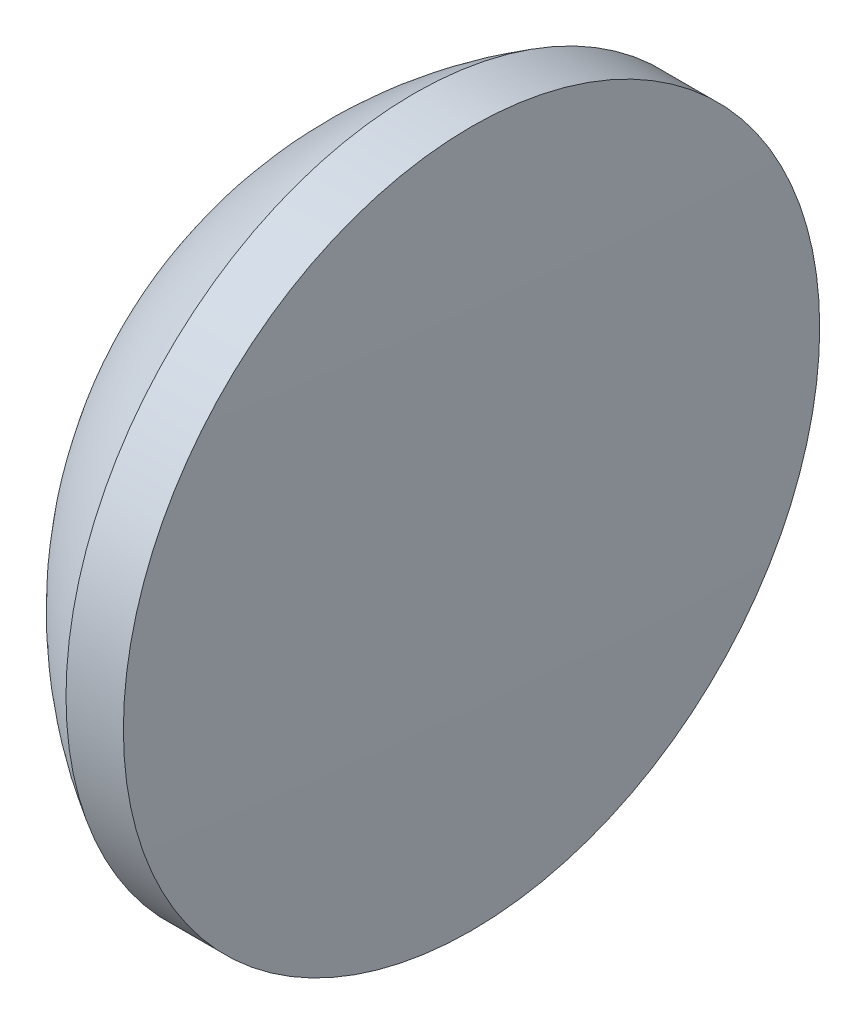
ISO-10303-21;
HEADER;
FILE_DESCRIPTION(('STEP AP214'),'2;1');
FILE_NAME('part.step','',(''),(''),'','','');
FILE_SCHEMA(('AUTOMOTIVE_DESIGN { 1 0 10303 214 1 1 1 1 }'));
ENDSEC;
DATA;
#1=APPLICATION_CONTEXT('core data for automotive mechanical design processes');
#2=APPLICATION_PROTOCOL_DEFINITION('international standard','automotive_design',2000,#1);
#3=PRODUCT_CONTEXT('',#1,'mechanical');
#4=PRODUCT('Part','Part','',(#3));
#5=PRODUCT_RELATED_PRODUCT_CATEGORY('part','',(#4));
#6=PRODUCT_DEFINITION_FORMATION('','',#4);
#7=PRODUCT_DEFINITION_CONTEXT('part definition',#1,'design');
#8=PRODUCT_DEFINITION('design','',#6,#7);
#9=PRODUCT_DEFINITION_SHAPE('','',#8);
#10=(LENGTH_UNIT() NAMED_UNIT(*) SI_UNIT(.MILLI.,.METRE.));
#11=(NAMED_UNIT(*) PLANE_ANGLE_UNIT() SI_UNIT($,.RADIAN.));
#12=(NAMED_UNIT(*) SI_UNIT($,.STERADIAN.) SOLID_ANGLE_UNIT());
#13=UNCERTAINTY_MEASURE_WITH_UNIT(LENGTH_MEASURE(1.E-05),#10,'distance_accuracy_value','');
#14=(GEOMETRIC_REPRESENTATION_CONTEXT(3) GLOBAL_UNCERTAINTY_ASSIGNED_CONTEXT((#13)) GLOBAL_UNIT_ASSIGNED_CONTEXT((#10,
#11,#12)) REPRESENTATION_CONTEXT('',''));
#15=CARTESIAN_POINT('',(0.,0.,0.));
#16=DIRECTION('',(0.,0.,1.));
#17=DIRECTION('',(1.,0.,0.));
#18=AXIS2_PLACEMENT_3D('',#15,#16,#17);
#19=CARTESIAN_POINT('',(0.,0.,0.));
#20=DIRECTION('',(-1.,0.,0.));
#21=DIRECTION('',(0.,-1.,0.));
#22=AXIS2_PLACEMENT_3D('',#19,#20,#21);
#23=SPHERICAL_SURFACE('',#22,2.02881873574851);
#24=CARTESIAN_POINT('',(-1.0090446241367,0.,0.));
#25=DIRECTION('',(-1.,0.,0.));
#26=DIRECTION('',(0.,-1.,0.));
#27=AXIS2_PLACEMENT_3D('',#24,#25,#26);
#28=CIRCLE('',#27,1.760095);
#29=CARTESIAN_POINT('',(-1.0090446241367,-1.760095,0.));
#30=VERTEX_POINT('',#29);
#31=EDGE_CURVE('E10',#30,#30,#28,.T.);
#32=ORIENTED_EDGE('',*,*,#31,.T.);
#33=EDGE_LOOP('',(#32));
#34=FACE_BOUND('',#33,.T.);
#35=ADVANCED_FACE('F33',(#34),#23,.T.);
#36=CARTESIAN_POINT('',(-2.02881873574851,0.,0.));
#37=DIRECTION('',(-1.,0.,0.));
#38=DIRECTION('',(0.,-1.,0.));
#39=AXIS2_PLACEMENT_3D('',#36,#37,#38);
#40=CYLINDRICAL_SURFACE('',#39,1.760095);
#41=CARTESIAN_POINT('',(-0.718960857474318,0.,0.));
#42=DIRECTION('',(-1.,0.,0.));
#43=DIRECTION('',(0.,-1.,0.));
#44=AXIS2_PLACEMENT_3D('',#41,#42,#43);
#45=CIRCLE('',#44,1.760095);
#46=CARTESIAN_POINT('',(-0.718960857474318,-1.760095,0.));
#47=VERTEX_POINT('',#46);
#48=EDGE_CURVE('E39',#47,#47,#45,.T.);
#49=ORIENTED_EDGE('',*,*,#48,.T.);
#50=EDGE_LOOP('',(#49));
#51=FACE_BOUND('',#50,.T.);
#52=ORIENTED_EDGE('',*,*,#31,.F.);
#53=EDGE_LOOP('',(#52));
#54=FACE_BOUND('',#53,.T.);
#55=ADVANCED_FACE('F45',(#51,#54),#40,.T.);
#56=CARTESIAN_POINT('',(-65.9511517357485,0.,0.));
#57=DIRECTION('',(-1.,0.,0.));
#58=DIRECTION('',(0.,-1.,0.));
#59=AXIS2_PLACEMENT_3D('',#56,#57,#58);
#60=SPHERICAL_SURFACE('',#59,65.255932);
#61=ORIENTED_EDGE('',*,*,#48,.F.);
#62=EDGE_LOOP('',(#61));
#63=FACE_BOUND('',#62,.T.);
#64=ADVANCED_FACE('F48',(#63),#60,.T.);
#65=CLOSED_SHELL('',(#35,#55,#64));
#66=MANIFOLD_SOLID_BREP('B2',#65);
#67=ADVANCED_BREP_SHAPE_REPRESENTATION('',(#18,#66),#14);
#68=SHAPE_DEFINITION_REPRESENTATION(#9,#67);
ENDSEC;
END-ISO-10303-21;
